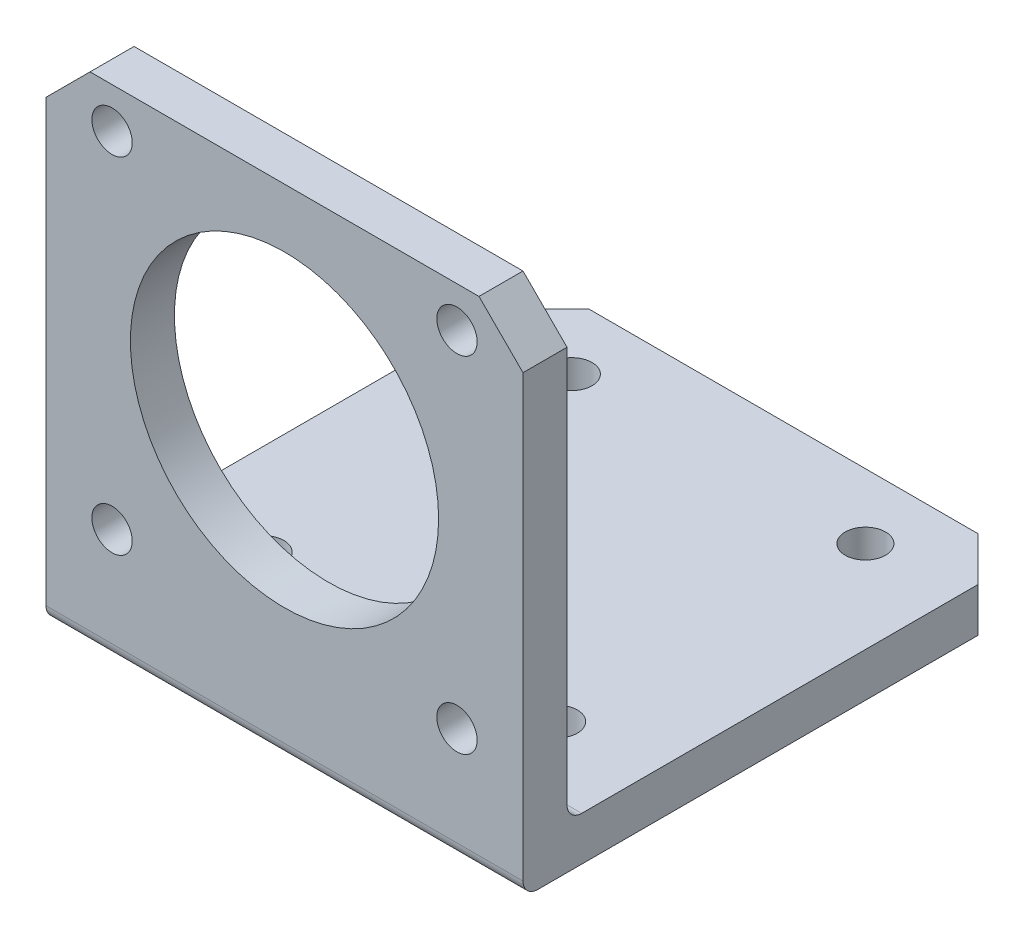
ISO-10303-21;
HEADER;
FILE_DESCRIPTION(('STEP AP214'),'2;1');
FILE_NAME('part.step','',(''),(''),'','','');
FILE_SCHEMA(('AUTOMOTIVE_DESIGN { 1 0 10303 214 1 1 1 1 }'));
ENDSEC;
DATA;
#1=APPLICATION_CONTEXT('core data for automotive mechanical design processes');
#2=APPLICATION_PROTOCOL_DEFINITION('international standard','automotive_design',2000,#1);
#3=PRODUCT_CONTEXT('',#1,'mechanical');
#4=PRODUCT('Part','Part','',(#3));
#5=PRODUCT_RELATED_PRODUCT_CATEGORY('part','',(#4));
#6=PRODUCT_DEFINITION_FORMATION('','',#4);
#7=PRODUCT_DEFINITION_CONTEXT('part definition',#1,'design');
#8=PRODUCT_DEFINITION('design','',#6,#7);
#9=PRODUCT_DEFINITION_SHAPE('','',#8);
#10=(LENGTH_UNIT() NAMED_UNIT(*) SI_UNIT(.MILLI.,.METRE.));
#11=(NAMED_UNIT(*) PLANE_ANGLE_UNIT() SI_UNIT($,.RADIAN.));
#12=(NAMED_UNIT(*) SI_UNIT($,.STERADIAN.) SOLID_ANGLE_UNIT());
#13=UNCERTAINTY_MEASURE_WITH_UNIT(LENGTH_MEASURE(1.E-05),#10,'distance_accuracy_value','');
#14=(GEOMETRIC_REPRESENTATION_CONTEXT(3) GLOBAL_UNCERTAINTY_ASSIGNED_CONTEXT((#13)) GLOBAL_UNIT_ASSIGNED_CONTEXT((#10,
#11,#12)) REPRESENTATION_CONTEXT('',''));
#15=CARTESIAN_POINT('',(0.,0.,0.));
#16=DIRECTION('',(0.,0.,1.));
#17=DIRECTION('',(1.,0.,0.));
#18=AXIS2_PLACEMENT_3D('',#15,#16,#17);
#19=CARTESIAN_POINT('',(0.,0.,0.));
#20=DIRECTION('',(0.,0.,1.));
#21=DIRECTION('',(1.,0.,0.));
#22=AXIS2_PLACEMENT_3D('',#19,#20,#21);
#23=PLANE('',#22);
#24=CARTESIAN_POINT('',(-19.953125,45.0796875,0.));
#25=DIRECTION('',(0.,0.,-1.));
#26=DIRECTION('',(1.,0.,0.));
#27=AXIS2_PLACEMENT_3D('',#24,#25,#26);
#28=CIRCLE('',#27,2.75);
#29=CARTESIAN_POINT('',(-17.203125,45.0796875,0.));
#30=VERTEX_POINT('',#29);
#31=EDGE_CURVE('E397',#30,#30,#28,.T.);
#32=ORIENTED_EDGE('',*,*,#31,.F.);
#33=EDGE_LOOP('',(#32));
#34=FACE_BOUND('',#33,.T.);
#35=CARTESIAN_POINT('',(-19.953125,-1.92031249999998,0.));
#36=DIRECTION('',(0.,0.,-1.));
#37=DIRECTION('',(-1.,0.,0.));
#38=AXIS2_PLACEMENT_3D('',#35,#36,#37);
#39=CIRCLE('',#38,2.75);
#40=CARTESIAN_POINT('',(-22.703125,-1.92031249999998,0.));
#41=VERTEX_POINT('',#40);
#42=EDGE_CURVE('E404',#41,#41,#39,.T.);
#43=ORIENTED_EDGE('',*,*,#42,.F.);
#44=EDGE_LOOP('',(#43));
#45=FACE_BOUND('',#44,.T.);
#46=CARTESIAN_POINT('',(27.046875,-1.92031249999999,0.));
#47=DIRECTION('',(0.,0.,-1.));
#48=DIRECTION('',(1.,0.,0.));
#49=AXIS2_PLACEMENT_3D('',#46,#47,#48);
#50=CIRCLE('',#49,2.75);
#51=CARTESIAN_POINT('',(29.796875,-1.92031249999999,0.));
#52=VERTEX_POINT('',#51);
#53=EDGE_CURVE('E392',#52,#52,#50,.T.);
#54=ORIENTED_EDGE('',*,*,#53,.F.);
#55=EDGE_LOOP('',(#54));
#56=FACE_BOUND('',#55,.T.);
#57=CARTESIAN_POINT('',(27.046875,45.0796875,0.));
#58=DIRECTION('',(0.,0.,-1.));
#59=DIRECTION('',(-1.,0.,0.));
#60=AXIS2_PLACEMENT_3D('',#57,#58,#59);
#61=CIRCLE('',#60,2.75);
#62=CARTESIAN_POINT('',(24.296875,45.0796875,0.));
#63=VERTEX_POINT('',#62);
#64=EDGE_CURVE('E220',#63,#63,#61,.T.);
#65=ORIENTED_EDGE('',*,*,#64,.F.);
#66=EDGE_LOOP('',(#65));
#67=FACE_BOUND('',#66,.T.);
#68=CARTESIAN_POINT('',(3.54687500000002,21.5796875,0.));
#69=DIRECTION('',(0.,0.,1.));
#70=DIRECTION('',(1.,0.,0.));
#71=AXIS2_PLACEMENT_3D('',#68,#69,#70);
#72=CIRCLE('',#71,21.);
#73=CARTESIAN_POINT('',(24.546875,21.5796875,0.));
#74=VERTEX_POINT('',#73);
#75=EDGE_CURVE('E224',#74,#74,#72,.T.);
#76=ORIENTED_EDGE('',*,*,#75,.T.);
#77=EDGE_LOOP('',(#76));
#78=FACE_BOUND('',#77,.T.);
#79=DIRECTION('',(0.,1.,0.));
#80=VECTOR('',#79,1.);
#81=CARTESIAN_POINT('',(36.046875,50.5796875,0.));
#82=LINE('',#81,#80);
#83=CARTESIAN_POINT('',(36.046875,-9.42031249999998,0.));
#84=VERTEX_POINT('',#83);
#85=CARTESIAN_POINT('',(36.046875,44.5796875,0.));
#86=VERTEX_POINT('',#85);
#87=EDGE_CURVE('E242',#84,#86,#82,.T.);
#88=ORIENTED_EDGE('',*,*,#87,.F.);
#89=DIRECTION('',(1.,0.,0.));
#90=VECTOR('',#89,1.);
#91=CARTESIAN_POINT('',(0.,-9.42031249999999,0.));
#92=LINE('',#91,#90);
#93=CARTESIAN_POINT('',(-28.953125,-9.42031249999999,0.));
#94=VERTEX_POINT('',#93);
#95=EDGE_CURVE('E60',#84,#94,#92,.F.);
#96=ORIENTED_EDGE('',*,*,#95,.T.);
#97=DIRECTION('',(0.,-1.,0.));
#98=VECTOR('',#97,1.);
#99=CARTESIAN_POINT('',(-28.953125,50.5796875,0.));
#100=LINE('',#99,#98);
#101=CARTESIAN_POINT('',(-28.953125,44.5796875,0.));
#102=VERTEX_POINT('',#101);
#103=EDGE_CURVE('E229',#102,#94,#100,.T.);
#104=ORIENTED_EDGE('',*,*,#103,.F.);
#105=DIRECTION('',(-0.707106781186548,-0.707106781186547,0.));
#106=VECTOR('',#105,1.);
#107=CARTESIAN_POINT('',(-28.953125,44.5796875,0.));
#108=LINE('',#107,#106);
#109=CARTESIAN_POINT('',(-22.953125,50.5796875,0.));
#110=VERTEX_POINT('',#109);
#111=EDGE_CURVE('E176',#102,#110,#108,.F.);
#112=ORIENTED_EDGE('',*,*,#111,.T.);
#113=DIRECTION('',(-1.,0.,0.));
#114=VECTOR('',#113,1.);
#115=CARTESIAN_POINT('',(-28.953125,50.5796875,0.));
#116=LINE('',#115,#114);
#117=CARTESIAN_POINT('',(30.046875,50.5796875,0.));
#118=VERTEX_POINT('',#117);
#119=EDGE_CURVE('E236',#118,#110,#116,.T.);
#120=ORIENTED_EDGE('',*,*,#119,.F.);
#121=DIRECTION('',(-0.707106781186546,0.707106781186549,0.));
#122=VECTOR('',#121,1.);
#123=CARTESIAN_POINT('',(30.046875,50.5796875,0.));
#124=LINE('',#123,#122);
#125=EDGE_CURVE('E187',#118,#86,#124,.F.);
#126=ORIENTED_EDGE('',*,*,#125,.T.);
#127=EDGE_LOOP('',(#88,#96,#104,#112,#120,#126));
#128=FACE_BOUND('',#127,.T.);
#129=ADVANCED_FACE('F45',(#34,#45,#56,#67,#78,#128),#23,.F.);
#130=CARTESIAN_POINT('',(0.,0.,6.));
#131=DIRECTION('',(0.,0.,1.));
#132=DIRECTION('',(1.,0.,0.));
#133=AXIS2_PLACEMENT_3D('',#130,#131,#132);
#134=PLANE('',#133);
#135=CARTESIAN_POINT('',(-19.953125,45.0796875,6.));
#136=DIRECTION('',(0.,0.,-1.));
#137=DIRECTION('',(1.,0.,0.));
#138=AXIS2_PLACEMENT_3D('',#135,#136,#137);
#139=CIRCLE('',#138,2.75);
#140=CARTESIAN_POINT('',(-17.203125,45.0796875,6.));
#141=VERTEX_POINT('',#140);
#142=EDGE_CURVE('E395',#141,#141,#139,.T.);
#143=ORIENTED_EDGE('',*,*,#142,.T.);
#144=EDGE_LOOP('',(#143));
#145=FACE_BOUND('',#144,.T.);
#146=CARTESIAN_POINT('',(-19.953125,-1.92031249999998,6.));
#147=DIRECTION('',(0.,0.,-1.));
#148=DIRECTION('',(-1.,0.,0.));
#149=AXIS2_PLACEMENT_3D('',#146,#147,#148);
#150=CIRCLE('',#149,2.75);
#151=CARTESIAN_POINT('',(-22.703125,-1.92031249999998,6.));
#152=VERTEX_POINT('',#151);
#153=EDGE_CURVE('E401',#152,#152,#150,.T.);
#154=ORIENTED_EDGE('',*,*,#153,.T.);
#155=EDGE_LOOP('',(#154));
#156=FACE_BOUND('',#155,.T.);
#157=CARTESIAN_POINT('',(27.046875,-1.92031249999999,6.));
#158=DIRECTION('',(0.,0.,-1.));
#159=DIRECTION('',(1.,0.,0.));
#160=AXIS2_PLACEMENT_3D('',#157,#158,#159);
#161=CIRCLE('',#160,2.75);
#162=CARTESIAN_POINT('',(29.796875,-1.92031249999999,6.));
#163=VERTEX_POINT('',#162);
#164=EDGE_CURVE('E407',#163,#163,#161,.T.);
#165=ORIENTED_EDGE('',*,*,#164,.T.);
#166=EDGE_LOOP('',(#165));
#167=FACE_BOUND('',#166,.T.);
#168=CARTESIAN_POINT('',(27.046875,45.0796875,6.));
#169=DIRECTION('',(0.,0.,-1.));
#170=DIRECTION('',(-1.,0.,0.));
#171=AXIS2_PLACEMENT_3D('',#168,#169,#170);
#172=CIRCLE('',#171,2.75);
#173=CARTESIAN_POINT('',(24.296875,45.0796875,6.));
#174=VERTEX_POINT('',#173);
#175=EDGE_CURVE('E215',#174,#174,#172,.T.);
#176=ORIENTED_EDGE('',*,*,#175,.T.);
#177=EDGE_LOOP('',(#176));
#178=FACE_BOUND('',#177,.T.);
#179=DIRECTION('',(0.,-1.,0.));
#180=VECTOR('',#179,1.);
#181=CARTESIAN_POINT('',(-28.953125,50.5796875,6.));
#182=LINE('',#181,#180);
#183=CARTESIAN_POINT('',(-28.953125,44.5796875,6.));
#184=VERTEX_POINT('',#183);
#185=CARTESIAN_POINT('',(-28.953125,-15.4203125,6.));
#186=VERTEX_POINT('',#185);
#187=EDGE_CURVE('E232',#184,#186,#182,.T.);
#188=ORIENTED_EDGE('',*,*,#187,.T.);
#189=DIRECTION('',(1.,0.,0.));
#190=VECTOR('',#189,1.);
#191=CARTESIAN_POINT('',(36.046875,-15.4203125,6.));
#192=LINE('',#191,#190);
#193=CARTESIAN_POINT('',(36.046875,-15.4203125,6.));
#194=VERTEX_POINT('',#193);
#195=EDGE_CURVE('E195',#186,#194,#192,.T.);
#196=ORIENTED_EDGE('',*,*,#195,.T.);
#197=DIRECTION('',(0.,1.,0.));
#198=VECTOR('',#197,1.);
#199=CARTESIAN_POINT('',(36.046875,50.5796875,6.));
#200=LINE('',#199,#198);
#201=CARTESIAN_POINT('',(36.046875,44.5796875,6.));
#202=VERTEX_POINT('',#201);
#203=EDGE_CURVE('E235',#194,#202,#200,.T.);
#204=ORIENTED_EDGE('',*,*,#203,.T.);
#205=DIRECTION('',(0.707106781186546,-0.707106781186549,0.));
#206=VECTOR('',#205,1.);
#207=CARTESIAN_POINT('',(40.3132812500001,40.3132812499999,6.));
#208=LINE('',#207,#206);
#209=CARTESIAN_POINT('',(30.046875,50.5796875,6.));
#210=VERTEX_POINT('',#209);
#211=EDGE_CURVE('E193',#202,#210,#208,.F.);
#212=ORIENTED_EDGE('',*,*,#211,.T.);
#213=DIRECTION('',(-1.,0.,0.));
#214=VECTOR('',#213,1.);
#215=CARTESIAN_POINT('',(-28.953125,50.5796875,6.));
#216=LINE('',#215,#214);
#217=CARTESIAN_POINT('',(-22.953125,50.5796875,6.));
#218=VERTEX_POINT('',#217);
#219=EDGE_CURVE('E143',#210,#218,#216,.T.);
#220=ORIENTED_EDGE('',*,*,#219,.T.);
#221=DIRECTION('',(0.707106781186548,0.707106781186547,0.));
#222=VECTOR('',#221,1.);
#223=CARTESIAN_POINT('',(-36.76640625,36.7664062500001,6.));
#224=LINE('',#223,#222);
#225=EDGE_CURVE('E182',#218,#184,#224,.F.);
#226=ORIENTED_EDGE('',*,*,#225,.T.);
#227=EDGE_LOOP('',(#188,#196,#204,#212,#220,#226));
#228=FACE_BOUND('',#227,.T.);
#229=CARTESIAN_POINT('',(3.54687500000002,21.5796875,6.));
#230=DIRECTION('',(0.,0.,1.));
#231=DIRECTION('',(1.,0.,0.));
#232=AXIS2_PLACEMENT_3D('',#229,#230,#231);
#233=CIRCLE('',#232,21.);
#234=CARTESIAN_POINT('',(24.546875,21.5796875,6.));
#235=VERTEX_POINT('',#234);
#236=EDGE_CURVE('E226',#235,#235,#233,.T.);
#237=ORIENTED_EDGE('',*,*,#236,.F.);
#238=EDGE_LOOP('',(#237));
#239=FACE_BOUND('',#238,.T.);
#240=ADVANCED_FACE('F259',(#145,#156,#167,#178,#228,#239),#134,.T.);
#241=CARTESIAN_POINT('',(-28.953125,50.5796875,6.));
#242=DIRECTION('',(1.,0.,0.));
#243=DIRECTION('',(0.,1.,0.));
#244=AXIS2_PLACEMENT_3D('',#241,#242,#243);
#245=PLANE('',#244);
#246=DIRECTION('',(0.,0.,-1.));
#247=VECTOR('',#246,1.);
#248=CARTESIAN_POINT('',(-28.953125,-17.4203125,6.));
#249=LINE('',#248,#247);
#250=CARTESIAN_POINT('',(-28.953125,-17.4203125,4.));
#251=VERTEX_POINT('',#250);
#252=CARTESIAN_POINT('',(-28.953125,-17.4203125,-56.));
#253=VERTEX_POINT('',#252);
#254=EDGE_CURVE('E142',#251,#253,#249,.T.);
#255=ORIENTED_EDGE('',*,*,#254,.F.);
#256=CARTESIAN_POINT('',(-28.953125,-15.4203125,4.));
#257=DIRECTION('',(1.,0.,0.));
#258=DIRECTION('',(0.,1.,0.));
#259=AXIS2_PLACEMENT_3D('',#256,#257,#258);
#260=CIRCLE('',#259,2.);
#261=EDGE_CURVE('E201',#251,#186,#260,.F.);
#262=ORIENTED_EDGE('',*,*,#261,.T.);
#263=ORIENTED_EDGE('',*,*,#187,.F.);
#264=DIRECTION('',(0.,0.,-1.));
#265=VECTOR('',#264,1.);
#266=CARTESIAN_POINT('',(-28.953125,44.5796875,6.));
#267=LINE('',#266,#265);
#268=EDGE_CURVE('E173',#184,#102,#267,.T.);
#269=ORIENTED_EDGE('',*,*,#268,.T.);
#270=ORIENTED_EDGE('',*,*,#103,.T.);
#271=CARTESIAN_POINT('',(-28.953125,-9.42031249999999,-2.));
#272=DIRECTION('',(1.,0.,0.));
#273=DIRECTION('',(0.,1.,0.));
#274=AXIS2_PLACEMENT_3D('',#271,#272,#273);
#275=CIRCLE('',#274,2.);
#276=CARTESIAN_POINT('',(-28.953125,-11.4203125,-2.));
#277=VERTEX_POINT('',#276);
#278=EDGE_CURVE('E12',#94,#277,#275,.T.);
#279=ORIENTED_EDGE('',*,*,#278,.T.);
#280=DIRECTION('',(0.,0.,1.));
#281=VECTOR('',#280,1.);
#282=CARTESIAN_POINT('',(-28.953125,-11.4203125,0.));
#283=LINE('',#282,#281);
#284=CARTESIAN_POINT('',(-28.953125,-11.4203125,-56.));
#285=VERTEX_POINT('',#284);
#286=EDGE_CURVE('E212',#285,#277,#283,.T.);
#287=ORIENTED_EDGE('',*,*,#286,.F.);
#288=DIRECTION('',(0.,-1.,0.));
#289=VECTOR('',#288,1.);
#290=CARTESIAN_POINT('',(-28.953125,-17.4203125,-56.));
#291=LINE('',#290,#289);
#292=EDGE_CURVE('E168',#285,#253,#291,.T.);
#293=ORIENTED_EDGE('',*,*,#292,.T.);
#294=EDGE_LOOP('',(#255,#262,#263,#269,#270,#279,#287,#293));
#295=FACE_BOUND('',#294,.T.);
#296=ADVANCED_FACE('F271',(#295),#245,.F.);
#297=CARTESIAN_POINT('',(-28.953125,-17.4203125,6.));
#298=DIRECTION('',(0.,1.,0.));
#299=DIRECTION('',(0.,0.,1.));
#300=AXIS2_PLACEMENT_3D('',#297,#298,#299);
#301=PLANE('',#300);
#302=CARTESIAN_POINT('',(23.546875,-17.4203125,-53.1567524631152));
#303=DIRECTION('',(0.,1.,0.));
#304=DIRECTION('',(-1.,0.,0.));
#305=AXIS2_PLACEMENT_3D('',#302,#303,#304);
#306=CIRCLE('',#305,2.75);
#307=CARTESIAN_POINT('',(20.796875,-17.4203125,-53.1567524631152));
#308=VERTEX_POINT('',#307);
#309=EDGE_CURVE('E373',#308,#308,#306,.T.);
#310=ORIENTED_EDGE('',*,*,#309,.T.);
#311=EDGE_LOOP('',(#310));
#312=FACE_BOUND('',#311,.T.);
#313=CARTESIAN_POINT('',(-16.453125,-17.4203125,-11.1567524631152));
#314=DIRECTION('',(0.,1.,0.));
#315=DIRECTION('',(1.,0.,0.));
#316=AXIS2_PLACEMENT_3D('',#313,#314,#315);
#317=CIRCLE('',#316,2.75);
#318=CARTESIAN_POINT('',(-13.703125,-17.4203125,-11.1567524631152));
#319=VERTEX_POINT('',#318);
#320=EDGE_CURVE('E368',#319,#319,#317,.T.);
#321=ORIENTED_EDGE('',*,*,#320,.T.);
#322=EDGE_LOOP('',(#321));
#323=FACE_BOUND('',#322,.T.);
#324=CARTESIAN_POINT('',(-16.453125,-17.4203125,-53.1567524631152));
#325=DIRECTION('',(0.,1.,0.));
#326=DIRECTION('',(1.,0.,0.));
#327=AXIS2_PLACEMENT_3D('',#324,#325,#326);
#328=CIRCLE('',#327,2.75);
#329=CARTESIAN_POINT('',(-13.703125,-17.4203125,-53.1567524631152));
#330=VERTEX_POINT('',#329);
#331=EDGE_CURVE('E383',#330,#330,#328,.T.);
#332=ORIENTED_EDGE('',*,*,#331,.T.);
#333=EDGE_LOOP('',(#332));
#334=FACE_BOUND('',#333,.T.);
#335=CARTESIAN_POINT('',(23.546875,-17.4203125,-11.1567524631152));
#336=DIRECTION('',(0.,1.,0.));
#337=DIRECTION('',(-1.,0.,0.));
#338=AXIS2_PLACEMENT_3D('',#335,#336,#337);
#339=CIRCLE('',#338,2.75);
#340=CARTESIAN_POINT('',(20.796875,-17.4203125,-11.1567524631152));
#341=VERTEX_POINT('',#340);
#342=EDGE_CURVE('E389',#341,#341,#339,.T.);
#343=ORIENTED_EDGE('',*,*,#342,.T.);
#344=EDGE_LOOP('',(#343));
#345=FACE_BOUND('',#344,.T.);
#346=DIRECTION('',(0.,0.,-1.));
#347=VECTOR('',#346,1.);
#348=CARTESIAN_POINT('',(36.046875,-17.4203125,6.));
#349=LINE('',#348,#347);
#350=CARTESIAN_POINT('',(36.046875,-17.4203125,4.));
#351=VERTEX_POINT('',#350);
#352=CARTESIAN_POINT('',(36.046875,-17.4203125,-56.));
#353=VERTEX_POINT('',#352);
#354=EDGE_CURVE('E132',#351,#353,#349,.T.);
#355=ORIENTED_EDGE('',*,*,#354,.F.);
#356=DIRECTION('',(1.,0.,0.));
#357=VECTOR('',#356,1.);
#358=CARTESIAN_POINT('',(-28.953125,-17.4203125,4.));
#359=LINE('',#358,#357);
#360=EDGE_CURVE('E199',#351,#251,#359,.F.);
#361=ORIENTED_EDGE('',*,*,#360,.T.);
#362=ORIENTED_EDGE('',*,*,#254,.T.);
#363=DIRECTION('',(0.707106781186547,0.,-0.707106781186548));
#364=VECTOR('',#363,1.);
#365=CARTESIAN_POINT('',(-22.953125,-17.4203125,-62.));
#366=LINE('',#365,#364);
#367=CARTESIAN_POINT('',(-22.953125,-17.4203125,-62.));
#368=VERTEX_POINT('',#367);
#369=EDGE_CURVE('E171',#253,#368,#366,.T.);
#370=ORIENTED_EDGE('',*,*,#369,.T.);
#371=DIRECTION('',(1.,0.,0.));
#372=VECTOR('',#371,1.);
#373=CARTESIAN_POINT('',(-28.953125,-17.4203125,-62.));
#374=LINE('',#373,#372);
#375=CARTESIAN_POINT('',(30.046875,-17.4203125,-62.));
#376=VERTEX_POINT('',#375);
#377=EDGE_CURVE('E149',#368,#376,#374,.T.);
#378=ORIENTED_EDGE('',*,*,#377,.T.);
#379=DIRECTION('',(0.707106781186548,0.,0.707106781186547));
#380=VECTOR('',#379,1.);
#381=CARTESIAN_POINT('',(36.046875,-17.4203125,-56.));
#382=LINE('',#381,#380);
#383=EDGE_CURVE('E146',#376,#353,#382,.T.);
#384=ORIENTED_EDGE('',*,*,#383,.T.);
#385=EDGE_LOOP('',(#355,#361,#362,#370,#378,#384));
#386=FACE_BOUND('',#385,.T.);
#387=ADVANCED_FACE('F147',(#312,#323,#334,#345,#386),#301,.F.);
#388=CARTESIAN_POINT('',(36.046875,50.5796875,6.));
#389=DIRECTION('',(-1.,0.,0.));
#390=DIRECTION('',(0.,-1.,0.));
#391=AXIS2_PLACEMENT_3D('',#388,#389,#390);
#392=PLANE('',#391);
#393=ORIENTED_EDGE('',*,*,#203,.F.);
#394=CARTESIAN_POINT('',(36.046875,-15.4203125,4.));
#395=DIRECTION('',(-1.,0.,0.));
#396=DIRECTION('',(0.,-1.,0.));
#397=AXIS2_PLACEMENT_3D('',#394,#395,#396);
#398=CIRCLE('',#397,2.);
#399=EDGE_CURVE('E139',#194,#351,#398,.F.);
#400=ORIENTED_EDGE('',*,*,#399,.T.);
#401=ORIENTED_EDGE('',*,*,#354,.T.);
#402=DIRECTION('',(0.,1.,0.));
#403=VECTOR('',#402,1.);
#404=CARTESIAN_POINT('',(36.046875,-11.4203125,-56.));
#405=LINE('',#404,#403);
#406=CARTESIAN_POINT('',(36.046875,-11.4203125,-56.));
#407=VERTEX_POINT('',#406);
#408=EDGE_CURVE('E137',#353,#407,#405,.T.);
#409=ORIENTED_EDGE('',*,*,#408,.T.);
#410=DIRECTION('',(0.,0.,1.));
#411=VECTOR('',#410,1.);
#412=CARTESIAN_POINT('',(36.046875,-11.4203125,0.));
#413=LINE('',#412,#411);
#414=CARTESIAN_POINT('',(36.046875,-11.4203125,-2.));
#415=VERTEX_POINT('',#414);
#416=EDGE_CURVE('E210',#407,#415,#413,.T.);
#417=ORIENTED_EDGE('',*,*,#416,.T.);
#418=CARTESIAN_POINT('',(36.046875,-9.42031249999998,-2.));
#419=DIRECTION('',(-1.,0.,0.));
#420=DIRECTION('',(0.,-1.,0.));
#421=AXIS2_PLACEMENT_3D('',#418,#419,#420);
#422=CIRCLE('',#421,2.);
#423=EDGE_CURVE('E53',#415,#84,#422,.T.);
#424=ORIENTED_EDGE('',*,*,#423,.T.);
#425=ORIENTED_EDGE('',*,*,#87,.T.);
#426=DIRECTION('',(0.,0.,1.));
#427=VECTOR('',#426,1.);
#428=CARTESIAN_POINT('',(36.046875,44.5796875,6.));
#429=LINE('',#428,#427);
#430=EDGE_CURVE('E190',#86,#202,#429,.T.);
#431=ORIENTED_EDGE('',*,*,#430,.T.);
#432=EDGE_LOOP('',(#393,#400,#401,#409,#417,#424,#425,#431));
#433=FACE_BOUND('',#432,.T.);
#434=ADVANCED_FACE('F135',(#433),#392,.F.);
#435=CARTESIAN_POINT('',(-28.953125,50.5796875,6.));
#436=DIRECTION('',(0.,-1.,0.));
#437=DIRECTION('',(0.,0.,-1.));
#438=AXIS2_PLACEMENT_3D('',#435,#436,#437);
#439=PLANE('',#438);
#440=ORIENTED_EDGE('',*,*,#219,.F.);
#441=DIRECTION('',(0.,0.,-1.));
#442=VECTOR('',#441,1.);
#443=CARTESIAN_POINT('',(30.046875,50.5796875,6.));
#444=LINE('',#443,#442);
#445=EDGE_CURVE('E184',#210,#118,#444,.T.);
#446=ORIENTED_EDGE('',*,*,#445,.T.);
#447=ORIENTED_EDGE('',*,*,#119,.T.);
#448=DIRECTION('',(0.,0.,1.));
#449=VECTOR('',#448,1.);
#450=CARTESIAN_POINT('',(-22.953125,50.5796875,6.));
#451=LINE('',#450,#449);
#452=EDGE_CURVE('E179',#110,#218,#451,.T.);
#453=ORIENTED_EDGE('',*,*,#452,.T.);
#454=EDGE_LOOP('',(#440,#446,#447,#453));
#455=FACE_BOUND('',#454,.T.);
#456=ADVANCED_FACE('F261',(#455),#439,.F.);
#457=CARTESIAN_POINT('',(3.54687500000002,21.5796875,6.));
#458=DIRECTION('',(0.,0.,-1.));
#459=DIRECTION('',(-1.,0.,0.));
#460=AXIS2_PLACEMENT_3D('',#457,#458,#459);
#461=CYLINDRICAL_SURFACE('',#460,21.);
#462=ORIENTED_EDGE('',*,*,#236,.T.);
#463=EDGE_LOOP('',(#462));
#464=FACE_BOUND('',#463,.T.);
#465=ORIENTED_EDGE('',*,*,#75,.F.);
#466=EDGE_LOOP('',(#465));
#467=FACE_BOUND('',#466,.T.);
#468=ADVANCED_FACE('F284',(#464,#467),#461,.F.);
#469=CARTESIAN_POINT('',(-28.953125,-11.4203125,-62.));
#470=DIRECTION('',(0.,0.,-1.));
#471=DIRECTION('',(-1.,0.,0.));
#472=AXIS2_PLACEMENT_3D('',#469,#470,#471);
#473=PLANE('',#472);
#474=ORIENTED_EDGE('',*,*,#377,.F.);
#475=DIRECTION('',(0.,1.,0.));
#476=VECTOR('',#475,1.);
#477=CARTESIAN_POINT('',(-22.953125,-11.4203125,-62.));
#478=LINE('',#477,#476);
#479=CARTESIAN_POINT('',(-22.953125,-11.4203125,-62.));
#480=VERTEX_POINT('',#479);
#481=EDGE_CURVE('E153',#368,#480,#478,.T.);
#482=ORIENTED_EDGE('',*,*,#481,.T.);
#483=DIRECTION('',(1.,0.,0.));
#484=VECTOR('',#483,1.);
#485=CARTESIAN_POINT('',(-28.953125,-11.4203125,-62.));
#486=LINE('',#485,#484);
#487=CARTESIAN_POINT('',(30.046875,-11.4203125,-62.));
#488=VERTEX_POINT('',#487);
#489=EDGE_CURVE('E217',#480,#488,#486,.T.);
#490=ORIENTED_EDGE('',*,*,#489,.T.);
#491=DIRECTION('',(0.,-1.,0.));
#492=VECTOR('',#491,1.);
#493=CARTESIAN_POINT('',(30.046875,-17.4203125,-62.));
#494=LINE('',#493,#492);
#495=EDGE_CURVE('E154',#488,#376,#494,.T.);
#496=ORIENTED_EDGE('',*,*,#495,.T.);
#497=EDGE_LOOP('',(#474,#482,#490,#496));
#498=FACE_BOUND('',#497,.T.);
#499=ADVANCED_FACE('F282',(#498),#473,.T.);
#500=CARTESIAN_POINT('',(-28.953125,-11.4203125,0.));
#501=DIRECTION('',(0.,1.,0.));
#502=DIRECTION('',(-1.,0.,0.));
#503=AXIS2_PLACEMENT_3D('',#500,#501,#502);
#504=PLANE('',#503);
#505=CARTESIAN_POINT('',(23.546875,-11.4203125,-53.1567524631152));
#506=DIRECTION('',(0.,1.,0.));
#507=DIRECTION('',(-1.,0.,0.));
#508=AXIS2_PLACEMENT_3D('',#505,#506,#507);
#509=CIRCLE('',#508,2.75);
#510=CARTESIAN_POINT('',(20.796875,-11.4203125,-53.1567524631152));
#511=VERTEX_POINT('',#510);
#512=EDGE_CURVE('E378',#511,#511,#509,.T.);
#513=ORIENTED_EDGE('',*,*,#512,.F.);
#514=EDGE_LOOP('',(#513));
#515=FACE_BOUND('',#514,.T.);
#516=CARTESIAN_POINT('',(-16.453125,-11.4203125,-11.1567524631152));
#517=DIRECTION('',(0.,1.,0.));
#518=DIRECTION('',(1.,0.,0.));
#519=AXIS2_PLACEMENT_3D('',#516,#517,#518);
#520=CIRCLE('',#519,2.75);
#521=CARTESIAN_POINT('',(-13.703125,-11.4203125,-11.1567524631152));
#522=VERTEX_POINT('',#521);
#523=EDGE_CURVE('E371',#522,#522,#520,.T.);
#524=ORIENTED_EDGE('',*,*,#523,.F.);
#525=EDGE_LOOP('',(#524));
#526=FACE_BOUND('',#525,.T.);
#527=CARTESIAN_POINT('',(-16.453125,-11.4203125,-53.1567524631152));
#528=DIRECTION('',(0.,1.,0.));
#529=DIRECTION('',(1.,0.,0.));
#530=AXIS2_PLACEMENT_3D('',#527,#528,#529);
#531=CIRCLE('',#530,2.75);
#532=CARTESIAN_POINT('',(-13.703125,-11.4203125,-53.1567524631152));
#533=VERTEX_POINT('',#532);
#534=EDGE_CURVE('E375',#533,#533,#531,.T.);
#535=ORIENTED_EDGE('',*,*,#534,.F.);
#536=EDGE_LOOP('',(#535));
#537=FACE_BOUND('',#536,.T.);
#538=CARTESIAN_POINT('',(23.546875,-11.4203125,-11.1567524631152));
#539=DIRECTION('',(0.,1.,0.));
#540=DIRECTION('',(-1.,0.,0.));
#541=AXIS2_PLACEMENT_3D('',#538,#539,#540);
#542=CIRCLE('',#541,2.75);
#543=CARTESIAN_POINT('',(20.796875,-11.4203125,-11.1567524631152));
#544=VERTEX_POINT('',#543);
#545=EDGE_CURVE('E386',#544,#544,#542,.T.);
#546=ORIENTED_EDGE('',*,*,#545,.F.);
#547=EDGE_LOOP('',(#546));
#548=FACE_BOUND('',#547,.T.);
#549=ORIENTED_EDGE('',*,*,#286,.T.);
#550=DIRECTION('',(1.,0.,0.));
#551=VECTOR('',#550,1.);
#552=CARTESIAN_POINT('',(-28.953125,-11.4203125,-2.));
#553=LINE('',#552,#551);
#554=EDGE_CURVE('E203',#277,#415,#553,.T.);
#555=ORIENTED_EDGE('',*,*,#554,.T.);
#556=ORIENTED_EDGE('',*,*,#416,.F.);
#557=DIRECTION('',(-0.707106781186548,0.,-0.707106781186547));
#558=VECTOR('',#557,1.);
#559=CARTESIAN_POINT('',(31.546875,-11.4203125,-60.5000000000001));
#560=LINE('',#559,#558);
#561=EDGE_CURVE('E158',#407,#488,#560,.T.);
#562=ORIENTED_EDGE('',*,*,#561,.T.);
#563=ORIENTED_EDGE('',*,*,#489,.F.);
#564=DIRECTION('',(-0.707106781186547,0.,0.707106781186548));
#565=VECTOR('',#564,1.);
#566=CARTESIAN_POINT('',(-56.953125,-11.4203125,-27.9999999999999));
#567=LINE('',#566,#565);
#568=EDGE_CURVE('E166',#480,#285,#567,.T.);
#569=ORIENTED_EDGE('',*,*,#568,.T.);
#570=EDGE_LOOP('',(#549,#555,#556,#562,#563,#569));
#571=FACE_BOUND('',#570,.T.);
#572=ADVANCED_FACE('F209',(#515,#526,#537,#548,#571),#504,.T.);
#573=CARTESIAN_POINT('',(36.046875,50.5796875,-56.));
#574=DIRECTION('',(0.707106781186547,0.,-0.707106781186548));
#575=DIRECTION('',(0.,-1.,0.));
#576=AXIS2_PLACEMENT_3D('',#573,#574,#575);
#577=PLANE('',#576);
#578=ORIENTED_EDGE('',*,*,#383,.F.);
#579=ORIENTED_EDGE('',*,*,#495,.F.);
#580=ORIENTED_EDGE('',*,*,#561,.F.);
#581=ORIENTED_EDGE('',*,*,#408,.F.);
#582=EDGE_LOOP('',(#578,#579,#580,#581));
#583=FACE_BOUND('',#582,.T.);
#584=ADVANCED_FACE('F156',(#583),#577,.T.);
#585=CARTESIAN_POINT('',(-22.953125,-11.4203125,-62.));
#586=DIRECTION('',(-0.707106781186548,0.,-0.707106781186547));
#587=DIRECTION('',(0.,-1.,0.));
#588=AXIS2_PLACEMENT_3D('',#585,#586,#587);
#589=PLANE('',#588);
#590=ORIENTED_EDGE('',*,*,#369,.F.);
#591=ORIENTED_EDGE('',*,*,#292,.F.);
#592=ORIENTED_EDGE('',*,*,#568,.F.);
#593=ORIENTED_EDGE('',*,*,#481,.F.);
#594=EDGE_LOOP('',(#590,#591,#592,#593));
#595=FACE_BOUND('',#594,.T.);
#596=ADVANCED_FACE('F279',(#595),#589,.T.);
#597=CARTESIAN_POINT('',(-28.953125,44.5796875,6.));
#598=DIRECTION('',(0.707106781186547,-0.707106781186548,0.));
#599=DIRECTION('',(0.,0.,-1.));
#600=AXIS2_PLACEMENT_3D('',#597,#598,#599);
#601=PLANE('',#600);
#602=ORIENTED_EDGE('',*,*,#225,.F.);
#603=ORIENTED_EDGE('',*,*,#452,.F.);
#604=ORIENTED_EDGE('',*,*,#111,.F.);
#605=ORIENTED_EDGE('',*,*,#268,.F.);
#606=EDGE_LOOP('',(#602,#603,#604,#605));
#607=FACE_BOUND('',#606,.T.);
#608=ADVANCED_FACE('F266',(#607),#601,.F.);
#609=CARTESIAN_POINT('',(30.046875,50.5796875,6.));
#610=DIRECTION('',(-0.707106781186549,-0.707106781186546,0.));
#611=DIRECTION('',(0.,0.,-1.));
#612=AXIS2_PLACEMENT_3D('',#609,#610,#611);
#613=PLANE('',#612);
#614=ORIENTED_EDGE('',*,*,#211,.F.);
#615=ORIENTED_EDGE('',*,*,#430,.F.);
#616=ORIENTED_EDGE('',*,*,#125,.F.);
#617=ORIENTED_EDGE('',*,*,#445,.F.);
#618=EDGE_LOOP('',(#614,#615,#616,#617));
#619=FACE_BOUND('',#618,.T.);
#620=ADVANCED_FACE('F256',(#619),#613,.F.);
#621=CARTESIAN_POINT('',(0.,-15.4203125,4.));
#622=DIRECTION('',(-1.,0.,0.));
#623=DIRECTION('',(0.,0.,1.));
#624=AXIS2_PLACEMENT_3D('',#621,#622,#623);
#625=CYLINDRICAL_SURFACE('',#624,2.);
#626=ORIENTED_EDGE('',*,*,#261,.F.);
#627=ORIENTED_EDGE('',*,*,#360,.F.);
#628=ORIENTED_EDGE('',*,*,#399,.F.);
#629=ORIENTED_EDGE('',*,*,#195,.F.);
#630=EDGE_LOOP('',(#626,#627,#628,#629));
#631=FACE_BOUND('',#630,.T.);
#632=ADVANCED_FACE('F274',(#631),#625,.T.);
#633=CARTESIAN_POINT('',(-28.953125,-9.42031249999999,-2.));
#634=DIRECTION('',(1.,0.,0.));
#635=DIRECTION('',(0.,1.,0.));
#636=AXIS2_PLACEMENT_3D('',#633,#634,#635);
#637=CYLINDRICAL_SURFACE('',#636,2.);
#638=ORIENTED_EDGE('',*,*,#278,.F.);
#639=ORIENTED_EDGE('',*,*,#95,.F.);
#640=ORIENTED_EDGE('',*,*,#423,.F.);
#641=ORIENTED_EDGE('',*,*,#554,.F.);
#642=EDGE_LOOP('',(#638,#639,#640,#641));
#643=FACE_BOUND('',#642,.T.);
#644=ADVANCED_FACE('F47',(#643),#637,.F.);
#645=CARTESIAN_POINT('',(27.046875,45.0796875,6.));
#646=DIRECTION('',(0.,0.,-1.));
#647=DIRECTION('',(-1.,0.,0.));
#648=AXIS2_PLACEMENT_3D('',#645,#646,#647);
#649=CYLINDRICAL_SURFACE('',#648,2.75);
#650=ORIENTED_EDGE('',*,*,#175,.F.);
#651=EDGE_LOOP('',(#650));
#652=FACE_BOUND('',#651,.T.);
#653=ORIENTED_EDGE('',*,*,#64,.T.);
#654=EDGE_LOOP('',(#653));
#655=FACE_BOUND('',#654,.T.);
#656=ADVANCED_FACE('F326',(#652,#655),#649,.F.);
#657=CARTESIAN_POINT('',(27.046875,-1.92031249999999,6.));
#658=DIRECTION('',(0.,0.,-1.));
#659=DIRECTION('',(-1.,0.,0.));
#660=AXIS2_PLACEMENT_3D('',#657,#658,#659);
#661=CYLINDRICAL_SURFACE('',#660,2.75);
#662=ORIENTED_EDGE('',*,*,#164,.F.);
#663=EDGE_LOOP('',(#662));
#664=FACE_BOUND('',#663,.T.);
#665=ORIENTED_EDGE('',*,*,#53,.T.);
#666=EDGE_LOOP('',(#665));
#667=FACE_BOUND('',#666,.T.);
#668=ADVANCED_FACE('F331',(#664,#667),#661,.F.);
#669=CARTESIAN_POINT('',(-19.953125,-1.92031249999998,6.));
#670=DIRECTION('',(0.,0.,-1.));
#671=DIRECTION('',(-1.,0.,0.));
#672=AXIS2_PLACEMENT_3D('',#669,#670,#671);
#673=CYLINDRICAL_SURFACE('',#672,2.75);
#674=ORIENTED_EDGE('',*,*,#153,.F.);
#675=EDGE_LOOP('',(#674));
#676=FACE_BOUND('',#675,.T.);
#677=ORIENTED_EDGE('',*,*,#42,.T.);
#678=EDGE_LOOP('',(#677));
#679=FACE_BOUND('',#678,.T.);
#680=ADVANCED_FACE('F336',(#676,#679),#673,.F.);
#681=CARTESIAN_POINT('',(-19.953125,45.0796875,6.));
#682=DIRECTION('',(0.,0.,-1.));
#683=DIRECTION('',(-1.,0.,0.));
#684=AXIS2_PLACEMENT_3D('',#681,#682,#683);
#685=CYLINDRICAL_SURFACE('',#684,2.75);
#686=ORIENTED_EDGE('',*,*,#142,.F.);
#687=EDGE_LOOP('',(#686));
#688=FACE_BOUND('',#687,.T.);
#689=ORIENTED_EDGE('',*,*,#31,.T.);
#690=EDGE_LOOP('',(#689));
#691=FACE_BOUND('',#690,.T.);
#692=ADVANCED_FACE('F344',(#688,#691),#685,.F.);
#693=CARTESIAN_POINT('',(23.546875,-17.4203125,-11.1567524631152));
#694=DIRECTION('',(0.,1.,0.));
#695=DIRECTION('',(-1.,0.,0.));
#696=AXIS2_PLACEMENT_3D('',#693,#694,#695);
#697=CYLINDRICAL_SURFACE('',#696,2.75);
#698=ORIENTED_EDGE('',*,*,#342,.F.);
#699=EDGE_LOOP('',(#698));
#700=FACE_BOUND('',#699,.T.);
#701=ORIENTED_EDGE('',*,*,#545,.T.);
#702=EDGE_LOOP('',(#701));
#703=FACE_BOUND('',#702,.T.);
#704=ADVANCED_FACE('F347',(#700,#703),#697,.F.);
#705=CARTESIAN_POINT('',(-16.453125,-17.4203125,-53.1567524631152));
#706=DIRECTION('',(0.,1.,0.));
#707=DIRECTION('',(-1.,0.,0.));
#708=AXIS2_PLACEMENT_3D('',#705,#706,#707);
#709=CYLINDRICAL_SURFACE('',#708,2.75);
#710=ORIENTED_EDGE('',*,*,#331,.F.);
#711=EDGE_LOOP('',(#710));
#712=FACE_BOUND('',#711,.T.);
#713=ORIENTED_EDGE('',*,*,#534,.T.);
#714=EDGE_LOOP('',(#713));
#715=FACE_BOUND('',#714,.T.);
#716=ADVANCED_FACE('F351',(#712,#715),#709,.F.);
#717=CARTESIAN_POINT('',(-16.453125,-17.4203125,-11.1567524631152));
#718=DIRECTION('',(0.,1.,0.));
#719=DIRECTION('',(-1.,0.,0.));
#720=AXIS2_PLACEMENT_3D('',#717,#718,#719);
#721=CYLINDRICAL_SURFACE('',#720,2.75);
#722=ORIENTED_EDGE('',*,*,#320,.F.);
#723=EDGE_LOOP('',(#722));
#724=FACE_BOUND('',#723,.T.);
#725=ORIENTED_EDGE('',*,*,#523,.T.);
#726=EDGE_LOOP('',(#725));
#727=FACE_BOUND('',#726,.T.);
#728=ADVANCED_FACE('F355',(#724,#727),#721,.F.);
#729=CARTESIAN_POINT('',(23.546875,-17.4203125,-53.1567524631152));
#730=DIRECTION('',(0.,1.,0.));
#731=DIRECTION('',(-1.,0.,0.));
#732=AXIS2_PLACEMENT_3D('',#729,#730,#731);
#733=CYLINDRICAL_SURFACE('',#732,2.75);
#734=ORIENTED_EDGE('',*,*,#309,.F.);
#735=EDGE_LOOP('',(#734));
#736=FACE_BOUND('',#735,.T.);
#737=ORIENTED_EDGE('',*,*,#512,.T.);
#738=EDGE_LOOP('',(#737));
#739=FACE_BOUND('',#738,.T.);
#740=ADVANCED_FACE('F357',(#736,#739),#733,.F.);
#741=CLOSED_SHELL('',(#129,#240,#296,#387,#434,#456,#468,#499,#572,#584,#596,#608,#620,#632,
#644,#656,#668,#680,#692,#704,#716,#728,#740));
#742=MANIFOLD_SOLID_BREP('B2',#741);
#743=ADVANCED_BREP_SHAPE_REPRESENTATION('',(#18,#742),#14);
#744=SHAPE_DEFINITION_REPRESENTATION(#9,#743);
ENDSEC;
END-ISO-10303-21;
